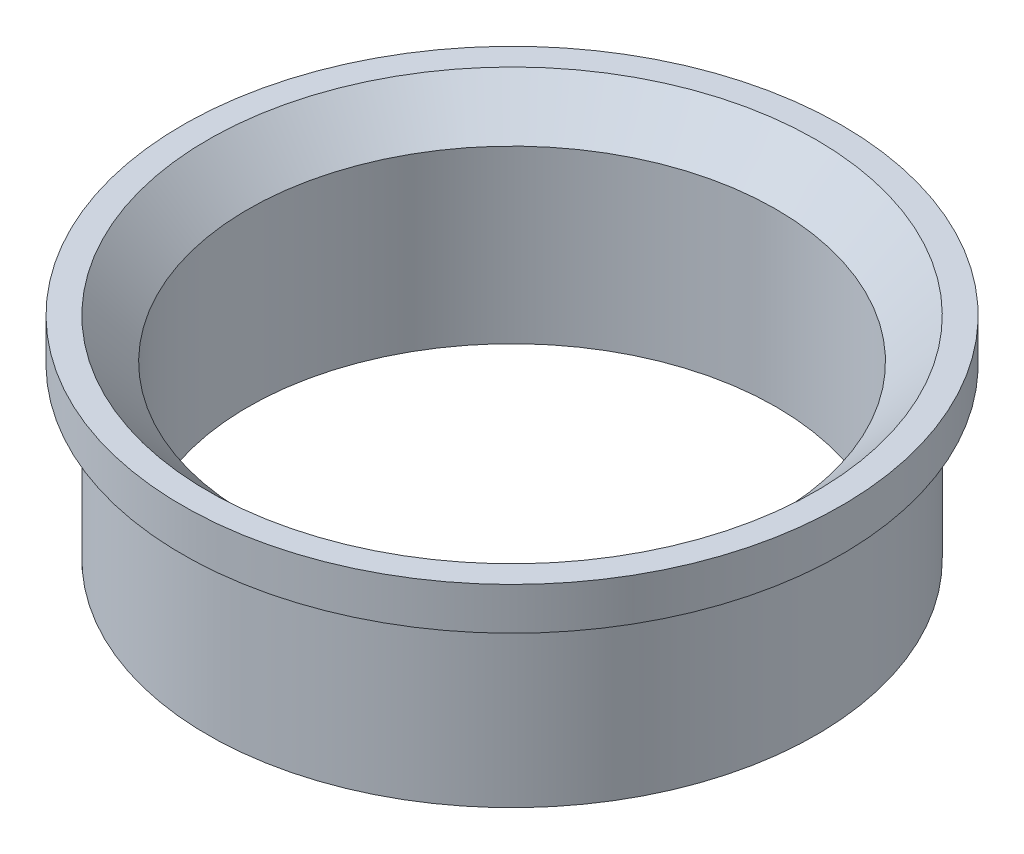
ISO-10303-21;
HEADER;
FILE_DESCRIPTION(('STEP AP214'),'2;1');
FILE_NAME('part.step','',(''),(''),'','','');
FILE_SCHEMA(('AUTOMOTIVE_DESIGN { 1 0 10303 214 1 1 1 1 }'));
ENDSEC;
DATA;
#1=APPLICATION_CONTEXT('core data for automotive mechanical design processes');
#2=APPLICATION_PROTOCOL_DEFINITION('international standard','automotive_design',2000,#1);
#3=PRODUCT_CONTEXT('',#1,'mechanical');
#4=PRODUCT('Part','Part','',(#3));
#5=PRODUCT_RELATED_PRODUCT_CATEGORY('part','',(#4));
#6=PRODUCT_DEFINITION_FORMATION('','',#4);
#7=PRODUCT_DEFINITION_CONTEXT('part definition',#1,'design');
#8=PRODUCT_DEFINITION('design','',#6,#7);
#9=PRODUCT_DEFINITION_SHAPE('','',#8);
#10=(LENGTH_UNIT() NAMED_UNIT(*) SI_UNIT(.MILLI.,.METRE.));
#11=(NAMED_UNIT(*) PLANE_ANGLE_UNIT() SI_UNIT($,.RADIAN.));
#12=(NAMED_UNIT(*) SI_UNIT($,.STERADIAN.) SOLID_ANGLE_UNIT());
#13=UNCERTAINTY_MEASURE_WITH_UNIT(LENGTH_MEASURE(1.E-05),#10,'distance_accuracy_value','');
#14=(GEOMETRIC_REPRESENTATION_CONTEXT(3) GLOBAL_UNCERTAINTY_ASSIGNED_CONTEXT((#13)) GLOBAL_UNIT_ASSIGNED_CONTEXT((#10,
#11,#12)) REPRESENTATION_CONTEXT('',''));
#15=CARTESIAN_POINT('',(0.,0.,0.));
#16=DIRECTION('',(0.,0.,1.));
#17=DIRECTION('',(1.,0.,0.));
#18=AXIS2_PLACEMENT_3D('',#15,#16,#17);
#19=CARTESIAN_POINT('',(-72.,0.,0.));
#20=DIRECTION('',(0.,1.,0.));
#21=DIRECTION('',(0.,0.,1.));
#22=AXIS2_PLACEMENT_3D('',#19,#20,#21);
#23=PLANE('',#22);
#24=CARTESIAN_POINT('',(0.,0.,0.));
#25=DIRECTION('',(0.,-1.,0.));
#26=DIRECTION('',(0.,0.,-1.));
#27=AXIS2_PLACEMENT_3D('',#24,#25,#26);
#28=CIRCLE('',#27,62.5);
#29=CARTESIAN_POINT('',(0.,0.,-62.5));
#30=VERTEX_POINT('',#29);
#31=EDGE_CURVE('E10',#30,#30,#28,.T.);
#32=ORIENTED_EDGE('',*,*,#31,.F.);
#33=EDGE_LOOP('',(#32));
#34=FACE_BOUND('',#33,.T.);
#35=CARTESIAN_POINT('',(0.,0.,0.));
#36=DIRECTION('',(0.,-1.,0.));
#37=DIRECTION('',(0.,0.,-1.));
#38=AXIS2_PLACEMENT_3D('',#35,#36,#37);
#39=CIRCLE('',#38,72.);
#40=CARTESIAN_POINT('',(0.,0.,-72.));
#41=VERTEX_POINT('',#40);
#42=EDGE_CURVE('E76',#41,#41,#39,.T.);
#43=ORIENTED_EDGE('',*,*,#42,.T.);
#44=EDGE_LOOP('',(#43));
#45=FACE_BOUND('',#44,.T.);
#46=ADVANCED_FACE('F45',(#34,#45),#23,.F.);
#47=CARTESIAN_POINT('',(0.,0.,0.));
#48=DIRECTION('',(0.,-1.,0.));
#49=DIRECTION('',(0.,0.,-1.));
#50=AXIS2_PLACEMENT_3D('',#47,#48,#49);
#51=CYLINDRICAL_SURFACE('',#50,62.5);
#52=CARTESIAN_POINT('',(0.,40.5,0.));
#53=DIRECTION('',(0.,-1.,0.));
#54=DIRECTION('',(0.,0.,-1.));
#55=AXIS2_PLACEMENT_3D('',#52,#53,#54);
#56=CIRCLE('',#55,62.5);
#57=CARTESIAN_POINT('',(0.,40.5,-62.5));
#58=VERTEX_POINT('',#57);
#59=EDGE_CURVE('E52',#58,#58,#56,.T.);
#60=ORIENTED_EDGE('',*,*,#59,.F.);
#61=EDGE_LOOP('',(#60));
#62=FACE_BOUND('',#61,.T.);
#63=ORIENTED_EDGE('',*,*,#31,.T.);
#64=EDGE_LOOP('',(#63));
#65=FACE_BOUND('',#64,.T.);
#66=ADVANCED_FACE('F108',(#62,#65),#51,.F.);
#67=CARTESIAN_POINT('',(0.,40.5,0.));
#68=DIRECTION('',(0.,1.,0.));
#69=DIRECTION('',(0.,0.,1.));
#70=AXIS2_PLACEMENT_3D('',#67,#68,#69);
#71=CONICAL_SURFACE('',#70,62.5,0.78539816339745);
#72=CARTESIAN_POINT('',(0.,50.,0.));
#73=DIRECTION('',(0.,-1.,0.));
#74=DIRECTION('',(0.,0.,-1.));
#75=AXIS2_PLACEMENT_3D('',#72,#73,#74);
#76=CIRCLE('',#75,72.);
#77=CARTESIAN_POINT('',(0.,50.,-72.));
#78=VERTEX_POINT('',#77);
#79=EDGE_CURVE('E57',#78,#78,#76,.T.);
#80=ORIENTED_EDGE('',*,*,#79,.F.);
#81=EDGE_LOOP('',(#80));
#82=FACE_BOUND('',#81,.T.);
#83=ORIENTED_EDGE('',*,*,#59,.T.);
#84=EDGE_LOOP('',(#83));
#85=FACE_BOUND('',#84,.T.);
#86=ADVANCED_FACE('F103',(#82,#85),#71,.F.);
#87=CARTESIAN_POINT('',(-72.,50.,0.));
#88=DIRECTION('',(0.,-1.,0.));
#89=DIRECTION('',(0.,0.,-1.));
#90=AXIS2_PLACEMENT_3D('',#87,#88,#89);
#91=PLANE('',#90);
#92=CARTESIAN_POINT('',(0.,50.,0.));
#93=DIRECTION('',(0.,-1.,0.));
#94=DIRECTION('',(0.,0.,-1.));
#95=AXIS2_PLACEMENT_3D('',#92,#93,#94);
#96=CIRCLE('',#95,78.);
#97=CARTESIAN_POINT('',(0.,50.,-78.));
#98=VERTEX_POINT('',#97);
#99=EDGE_CURVE('E62',#98,#98,#96,.T.);
#100=ORIENTED_EDGE('',*,*,#99,.F.);
#101=EDGE_LOOP('',(#100));
#102=FACE_BOUND('',#101,.T.);
#103=ORIENTED_EDGE('',*,*,#79,.T.);
#104=EDGE_LOOP('',(#103));
#105=FACE_BOUND('',#104,.T.);
#106=ADVANCED_FACE('F97',(#102,#105),#91,.F.);
#107=CARTESIAN_POINT('',(0.,0.,0.));
#108=DIRECTION('',(0.,-1.,0.));
#109=DIRECTION('',(0.,0.,-1.));
#110=AXIS2_PLACEMENT_3D('',#107,#108,#109);
#111=CYLINDRICAL_SURFACE('',#110,78.);
#112=CARTESIAN_POINT('',(0.,40.,0.));
#113=DIRECTION('',(0.,-1.,0.));
#114=DIRECTION('',(0.,0.,-1.));
#115=AXIS2_PLACEMENT_3D('',#112,#113,#114);
#116=CIRCLE('',#115,78.);
#117=CARTESIAN_POINT('',(0.,40.,-78.));
#118=VERTEX_POINT('',#117);
#119=EDGE_CURVE('E68',#118,#118,#116,.T.);
#120=ORIENTED_EDGE('',*,*,#119,.F.);
#121=EDGE_LOOP('',(#120));
#122=FACE_BOUND('',#121,.T.);
#123=ORIENTED_EDGE('',*,*,#99,.T.);
#124=EDGE_LOOP('',(#123));
#125=FACE_BOUND('',#124,.T.);
#126=ADVANCED_FACE('F91',(#122,#125),#111,.T.);
#127=CARTESIAN_POINT('',(-78.,40.,0.));
#128=DIRECTION('',(0.,1.,0.));
#129=DIRECTION('',(0.,0.,1.));
#130=AXIS2_PLACEMENT_3D('',#127,#128,#129);
#131=PLANE('',#130);
#132=CARTESIAN_POINT('',(0.,40.,0.));
#133=DIRECTION('',(0.,-1.,0.));
#134=DIRECTION('',(0.,0.,-1.));
#135=AXIS2_PLACEMENT_3D('',#132,#133,#134);
#136=CIRCLE('',#135,72.);
#137=CARTESIAN_POINT('',(0.,40.,-72.));
#138=VERTEX_POINT('',#137);
#139=EDGE_CURVE('E72',#138,#138,#136,.T.);
#140=ORIENTED_EDGE('',*,*,#139,.F.);
#141=EDGE_LOOP('',(#140));
#142=FACE_BOUND('',#141,.T.);
#143=ORIENTED_EDGE('',*,*,#119,.T.);
#144=EDGE_LOOP('',(#143));
#145=FACE_BOUND('',#144,.T.);
#146=ADVANCED_FACE('F85',(#142,#145),#131,.F.);
#147=CARTESIAN_POINT('',(0.,0.,0.));
#148=DIRECTION('',(0.,-1.,0.));
#149=DIRECTION('',(0.,0.,-1.));
#150=AXIS2_PLACEMENT_3D('',#147,#148,#149);
#151=CYLINDRICAL_SURFACE('',#150,72.);
#152=ORIENTED_EDGE('',*,*,#42,.F.);
#153=EDGE_LOOP('',(#152));
#154=FACE_BOUND('',#153,.T.);
#155=ORIENTED_EDGE('',*,*,#139,.T.);
#156=EDGE_LOOP('',(#155));
#157=FACE_BOUND('',#156,.T.);
#158=ADVANCED_FACE('F82',(#154,#157),#151,.T.);
#159=CLOSED_SHELL('',(#46,#66,#86,#106,#126,#146,#158));
#160=MANIFOLD_SOLID_BREP('B2',#159);
#161=ADVANCED_BREP_SHAPE_REPRESENTATION('',(#18,#160),#14);
#162=SHAPE_DEFINITION_REPRESENTATION(#9,#161);
ENDSEC;
END-ISO-10303-21;
